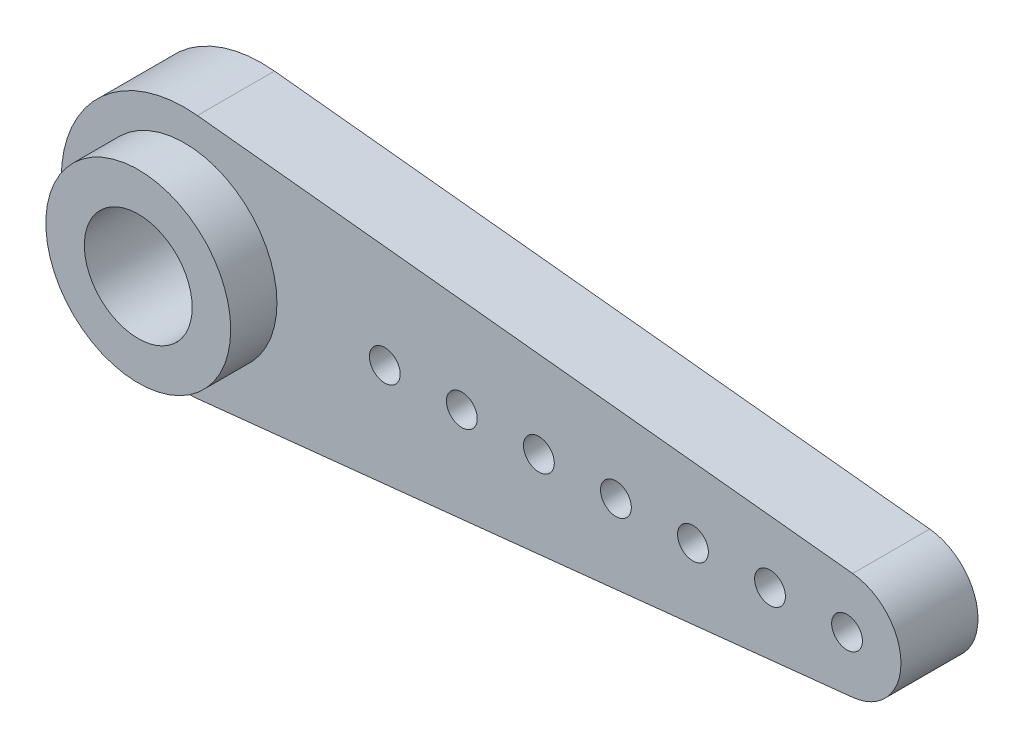
ISO-10303-21;
HEADER;
FILE_DESCRIPTION(('STEP AP214'),'2;1');
FILE_NAME('part.step','',(''),(''),'','','');
FILE_SCHEMA(('AUTOMOTIVE_DESIGN { 1 0 10303 214 1 1 1 1 }'));
ENDSEC;
DATA;
#1=APPLICATION_CONTEXT('core data for automotive mechanical design processes');
#2=APPLICATION_PROTOCOL_DEFINITION('international standard','automotive_design',2000,#1);
#3=PRODUCT_CONTEXT('',#1,'mechanical');
#4=PRODUCT('Part','Part','',(#3));
#5=PRODUCT_RELATED_PRODUCT_CATEGORY('part','',(#4));
#6=PRODUCT_DEFINITION_FORMATION('','',#4);
#7=PRODUCT_DEFINITION_CONTEXT('part definition',#1,'design');
#8=PRODUCT_DEFINITION('design','',#6,#7);
#9=PRODUCT_DEFINITION_SHAPE('','',#8);
#10=(LENGTH_UNIT() NAMED_UNIT(*) SI_UNIT(.MILLI.,.METRE.));
#11=(NAMED_UNIT(*) PLANE_ANGLE_UNIT() SI_UNIT($,.RADIAN.));
#12=(NAMED_UNIT(*) SI_UNIT($,.STERADIAN.) SOLID_ANGLE_UNIT());
#13=UNCERTAINTY_MEASURE_WITH_UNIT(LENGTH_MEASURE(1.E-05),#10,'distance_accuracy_value','');
#14=(GEOMETRIC_REPRESENTATION_CONTEXT(3) GLOBAL_UNCERTAINTY_ASSIGNED_CONTEXT((#13)) GLOBAL_UNIT_ASSIGNED_CONTEXT((#10,
#11,#12)) REPRESENTATION_CONTEXT('',''));
#15=CARTESIAN_POINT('',(0.,0.,0.));
#16=DIRECTION('',(0.,0.,1.));
#17=DIRECTION('',(1.,0.,0.));
#18=AXIS2_PLACEMENT_3D('',#15,#16,#17);
#19=CARTESIAN_POINT('',(0.,0.,5.));
#20=DIRECTION('',(0.,0.,-1.));
#21=DIRECTION('',(-1.,0.,0.));
#22=AXIS2_PLACEMENT_3D('',#19,#20,#21);
#23=CYLINDRICAL_SURFACE('',#22,1.5);
#24=CARTESIAN_POINT('',(0.,0.,0.));
#25=DIRECTION('',(0.,0.,1.));
#26=DIRECTION('',(1.,0.,0.));
#27=AXIS2_PLACEMENT_3D('',#24,#25,#26);
#28=CIRCLE('',#27,1.5);
#29=CARTESIAN_POINT('',(1.5,0.,0.));
#30=VERTEX_POINT('',#29);
#31=EDGE_CURVE('E117',#30,#30,#28,.T.);
#32=ORIENTED_EDGE('',*,*,#31,.F.);
#33=EDGE_LOOP('',(#32));
#34=FACE_BOUND('',#33,.T.);
#35=CARTESIAN_POINT('',(0.,0.,3.));
#36=DIRECTION('',(0.,0.,1.));
#37=DIRECTION('',(1.,0.,0.));
#38=AXIS2_PLACEMENT_3D('',#35,#36,#37);
#39=CIRCLE('',#38,1.5);
#40=CARTESIAN_POINT('',(1.5,0.,3.));
#41=VERTEX_POINT('',#40);
#42=EDGE_CURVE('E36',#41,#41,#39,.T.);
#43=ORIENTED_EDGE('',*,*,#42,.T.);
#44=EDGE_LOOP('',(#43));
#45=FACE_BOUND('',#44,.T.);
#46=ADVANCED_FACE('F32',(#34,#45),#23,.F.);
#47=CARTESIAN_POINT('',(0.,0.,5.));
#48=DIRECTION('',(0.,0.,1.));
#49=DIRECTION('',(1.,0.,0.));
#50=AXIS2_PLACEMENT_3D('',#47,#48,#49);
#51=PLANE('',#50);
#52=CARTESIAN_POINT('',(13.,0.,5.));
#53=DIRECTION('',(0.,0.,1.));
#54=DIRECTION('',(1.,0.,0.));
#55=AXIS2_PLACEMENT_3D('',#52,#53,#54);
#56=CIRCLE('',#55,0.999999999999998);
#57=CARTESIAN_POINT('',(14.,0.,5.));
#58=VERTEX_POINT('',#57);
#59=EDGE_CURVE('E150',#58,#58,#56,.T.);
#60=ORIENTED_EDGE('',*,*,#59,.F.);
#61=EDGE_LOOP('',(#60));
#62=FACE_BOUND('',#61,.T.);
#63=CARTESIAN_POINT('',(23.,0.,5.));
#64=DIRECTION('',(0.,0.,1.));
#65=DIRECTION('',(1.,0.,0.));
#66=AXIS2_PLACEMENT_3D('',#63,#64,#65);
#67=CIRCLE('',#66,0.999999999999998);
#68=CARTESIAN_POINT('',(24.,0.,5.));
#69=VERTEX_POINT('',#68);
#70=EDGE_CURVE('E138',#69,#69,#67,.T.);
#71=ORIENTED_EDGE('',*,*,#70,.F.);
#72=EDGE_LOOP('',(#71));
#73=FACE_BOUND('',#72,.T.);
#74=CARTESIAN_POINT('',(33.,0.,5.));
#75=DIRECTION('',(0.,0.,1.));
#76=DIRECTION('',(1.,0.,0.));
#77=AXIS2_PLACEMENT_3D('',#74,#75,#76);
#78=CIRCLE('',#77,0.999999999999998);
#79=CARTESIAN_POINT('',(34.,0.,5.));
#80=VERTEX_POINT('',#79);
#81=EDGE_CURVE('E126',#80,#80,#78,.T.);
#82=ORIENTED_EDGE('',*,*,#81,.F.);
#83=EDGE_LOOP('',(#82));
#84=FACE_BOUND('',#83,.T.);
#85=CARTESIAN_POINT('',(0.,0.,5.));
#86=DIRECTION('',(0.,0.,1.));
#87=DIRECTION('',(1.,0.,0.));
#88=AXIS2_PLACEMENT_3D('',#85,#86,#87);
#89=CIRCLE('',#88,8.00000000000001);
#90=CARTESIAN_POINT('',(0.837209302325579,7.95607193180778,5.));
#91=VERTEX_POINT('',#90);
#92=CARTESIAN_POINT('',(0.837209302325579,-7.95607193180778,5.));
#93=VERTEX_POINT('',#92);
#94=EDGE_CURVE('E86',#91,#93,#89,.T.);
#95=ORIENTED_EDGE('',*,*,#94,.T.);
#96=DIRECTION('',(0.994508991475972,0.104651162790698,0.));
#97=VECTOR('',#96,1.);
#98=CARTESIAN_POINT('',(0.837209302325579,-7.95607193180778,5.));
#99=LINE('',#98,#97);
#100=CARTESIAN_POINT('',(43.3662790697674,-3.4807814701659,5.));
#101=VERTEX_POINT('',#100);
#102=EDGE_CURVE('E80',#93,#101,#99,.T.);
#103=ORIENTED_EDGE('',*,*,#102,.T.);
#104=CARTESIAN_POINT('',(43.,0.,5.));
#105=DIRECTION('',(0.,0.,1.));
#106=DIRECTION('',(1.,0.,0.));
#107=AXIS2_PLACEMENT_3D('',#104,#105,#106);
#108=CIRCLE('',#107,3.5);
#109=CARTESIAN_POINT('',(43.3662790697674,3.4807814701659,5.));
#110=VERTEX_POINT('',#109);
#111=EDGE_CURVE('E84',#101,#110,#108,.T.);
#112=ORIENTED_EDGE('',*,*,#111,.T.);
#113=DIRECTION('',(-0.994508991475972,0.104651162790698,0.));
#114=VECTOR('',#113,1.);
#115=CARTESIAN_POINT('',(0.837209302325579,7.95607193180778,5.));
#116=LINE('',#115,#114);
#117=EDGE_CURVE('E50',#110,#91,#116,.T.);
#118=ORIENTED_EDGE('',*,*,#117,.T.);
#119=EDGE_LOOP('',(#95,#103,#112,#118));
#120=FACE_BOUND('',#119,.T.);
#121=CARTESIAN_POINT('',(43.,0.,5.));
#122=DIRECTION('',(0.,0.,1.));
#123=DIRECTION('',(1.,0.,0.));
#124=AXIS2_PLACEMENT_3D('',#121,#122,#123);
#125=CIRCLE('',#124,0.999999999999998);
#126=CARTESIAN_POINT('',(44.,0.,5.));
#127=VERTEX_POINT('',#126);
#128=EDGE_CURVE('E102',#127,#127,#125,.T.);
#129=ORIENTED_EDGE('',*,*,#128,.F.);
#130=EDGE_LOOP('',(#129));
#131=FACE_BOUND('',#130,.T.);
#132=CARTESIAN_POINT('',(38.,0.,5.));
#133=DIRECTION('',(0.,0.,1.));
#134=DIRECTION('',(1.,0.,0.));
#135=AXIS2_PLACEMENT_3D('',#132,#133,#134);
#136=CIRCLE('',#135,0.999999999999998);
#137=CARTESIAN_POINT('',(39.,0.,5.));
#138=VERTEX_POINT('',#137);
#139=EDGE_CURVE('E122',#138,#138,#136,.T.);
#140=ORIENTED_EDGE('',*,*,#139,.F.);
#141=EDGE_LOOP('',(#140));
#142=FACE_BOUND('',#141,.T.);
#143=CARTESIAN_POINT('',(28.,0.,5.));
#144=DIRECTION('',(0.,0.,1.));
#145=DIRECTION('',(1.,0.,0.));
#146=AXIS2_PLACEMENT_3D('',#143,#144,#145);
#147=CIRCLE('',#146,0.999999999999998);
#148=CARTESIAN_POINT('',(29.,0.,5.));
#149=VERTEX_POINT('',#148);
#150=EDGE_CURVE('E132',#149,#149,#147,.T.);
#151=ORIENTED_EDGE('',*,*,#150,.F.);
#152=EDGE_LOOP('',(#151));
#153=FACE_BOUND('',#152,.T.);
#154=CARTESIAN_POINT('',(18.,0.,5.));
#155=DIRECTION('',(0.,0.,1.));
#156=DIRECTION('',(1.,0.,0.));
#157=AXIS2_PLACEMENT_3D('',#154,#155,#156);
#158=CIRCLE('',#157,0.999999999999998);
#159=CARTESIAN_POINT('',(19.,0.,5.));
#160=VERTEX_POINT('',#159);
#161=EDGE_CURVE('E144',#160,#160,#158,.T.);
#162=ORIENTED_EDGE('',*,*,#161,.F.);
#163=EDGE_LOOP('',(#162));
#164=FACE_BOUND('',#163,.T.);
#165=CARTESIAN_POINT('',(0.,0.,5.));
#166=DIRECTION('',(0.,0.,1.));
#167=DIRECTION('',(1.,0.,0.));
#168=AXIS2_PLACEMENT_3D('',#165,#166,#167);
#169=CIRCLE('',#168,6.);
#170=CARTESIAN_POINT('',(6.,0.,5.));
#171=VERTEX_POINT('',#170);
#172=EDGE_CURVE('E159',#171,#171,#169,.T.);
#173=ORIENTED_EDGE('',*,*,#172,.F.);
#174=EDGE_LOOP('',(#173));
#175=FACE_BOUND('',#174,.T.);
#176=ADVANCED_FACE('F81',(#62,#73,#84,#120,#131,#142,#153,#164,#175),#51,.T.);
#177=CARTESIAN_POINT('',(0.,0.,0.));
#178=DIRECTION('',(0.,0.,1.));
#179=DIRECTION('',(1.,0.,0.));
#180=AXIS2_PLACEMENT_3D('',#177,#178,#179);
#181=PLANE('',#180);
#182=CARTESIAN_POINT('',(18.,0.,0.));
#183=DIRECTION('',(0.,0.,1.));
#184=DIRECTION('',(1.,0.,0.));
#185=AXIS2_PLACEMENT_3D('',#182,#183,#184);
#186=CIRCLE('',#185,0.999999999999998);
#187=CARTESIAN_POINT('',(19.,0.,0.));
#188=VERTEX_POINT('',#187);
#189=EDGE_CURVE('E147',#188,#188,#186,.T.);
#190=ORIENTED_EDGE('',*,*,#189,.T.);
#191=EDGE_LOOP('',(#190));
#192=FACE_BOUND('',#191,.T.);
#193=CARTESIAN_POINT('',(28.,0.,0.));
#194=DIRECTION('',(0.,0.,1.));
#195=DIRECTION('',(1.,0.,0.));
#196=AXIS2_PLACEMENT_3D('',#193,#194,#195);
#197=CIRCLE('',#196,0.999999999999998);
#198=CARTESIAN_POINT('',(29.,0.,0.));
#199=VERTEX_POINT('',#198);
#200=EDGE_CURVE('E135',#199,#199,#197,.T.);
#201=ORIENTED_EDGE('',*,*,#200,.T.);
#202=EDGE_LOOP('',(#201));
#203=FACE_BOUND('',#202,.T.);
#204=CARTESIAN_POINT('',(38.,0.,0.));
#205=DIRECTION('',(0.,0.,1.));
#206=DIRECTION('',(1.,0.,0.));
#207=AXIS2_PLACEMENT_3D('',#204,#205,#206);
#208=CIRCLE('',#207,0.999999999999998);
#209=CARTESIAN_POINT('',(39.,0.,0.));
#210=VERTEX_POINT('',#209);
#211=EDGE_CURVE('E123',#210,#210,#208,.T.);
#212=ORIENTED_EDGE('',*,*,#211,.T.);
#213=EDGE_LOOP('',(#212));
#214=FACE_BOUND('',#213,.T.);
#215=CARTESIAN_POINT('',(43.,0.,0.));
#216=DIRECTION('',(0.,0.,1.));
#217=DIRECTION('',(1.,0.,0.));
#218=AXIS2_PLACEMENT_3D('',#215,#216,#217);
#219=CIRCLE('',#218,0.999999999999998);
#220=CARTESIAN_POINT('',(44.,0.,0.));
#221=VERTEX_POINT('',#220);
#222=EDGE_CURVE('E114',#221,#221,#219,.T.);
#223=ORIENTED_EDGE('',*,*,#222,.T.);
#224=EDGE_LOOP('',(#223));
#225=FACE_BOUND('',#224,.T.);
#226=CARTESIAN_POINT('',(0.,0.,0.));
#227=DIRECTION('',(0.,0.,1.));
#228=DIRECTION('',(1.,0.,0.));
#229=AXIS2_PLACEMENT_3D('',#226,#227,#228);
#230=CIRCLE('',#229,8.00000000000001);
#231=CARTESIAN_POINT('',(0.837209302325579,7.95607193180778,0.));
#232=VERTEX_POINT('',#231);
#233=CARTESIAN_POINT('',(0.837209302325579,-7.95607193180778,0.));
#234=VERTEX_POINT('',#233);
#235=EDGE_CURVE('E99',#232,#234,#230,.T.);
#236=ORIENTED_EDGE('',*,*,#235,.F.);
#237=DIRECTION('',(-0.994508991475972,0.104651162790698,0.));
#238=VECTOR('',#237,1.);
#239=CARTESIAN_POINT('',(0.837209302325579,7.95607193180778,0.));
#240=LINE('',#239,#238);
#241=CARTESIAN_POINT('',(43.3662790697674,3.4807814701659,0.));
#242=VERTEX_POINT('',#241);
#243=EDGE_CURVE('E73',#242,#232,#240,.T.);
#244=ORIENTED_EDGE('',*,*,#243,.F.);
#245=CARTESIAN_POINT('',(43.,0.,0.));
#246=DIRECTION('',(0.,0.,1.));
#247=DIRECTION('',(1.,0.,0.));
#248=AXIS2_PLACEMENT_3D('',#245,#246,#247);
#249=CIRCLE('',#248,3.5);
#250=CARTESIAN_POINT('',(43.3662790697674,-3.4807814701659,0.));
#251=VERTEX_POINT('',#250);
#252=EDGE_CURVE('E67',#251,#242,#249,.T.);
#253=ORIENTED_EDGE('',*,*,#252,.F.);
#254=DIRECTION('',(0.994508991475972,0.104651162790698,0.));
#255=VECTOR('',#254,1.);
#256=CARTESIAN_POINT('',(0.837209302325579,-7.95607193180778,0.));
#257=LINE('',#256,#255);
#258=EDGE_CURVE('E90',#234,#251,#257,.T.);
#259=ORIENTED_EDGE('',*,*,#258,.F.);
#260=EDGE_LOOP('',(#236,#244,#253,#259));
#261=FACE_BOUND('',#260,.T.);
#262=ORIENTED_EDGE('',*,*,#31,.T.);
#263=EDGE_LOOP('',(#262));
#264=FACE_BOUND('',#263,.T.);
#265=CARTESIAN_POINT('',(33.,0.,0.));
#266=DIRECTION('',(0.,0.,1.));
#267=DIRECTION('',(1.,0.,0.));
#268=AXIS2_PLACEMENT_3D('',#265,#266,#267);
#269=CIRCLE('',#268,0.999999999999998);
#270=CARTESIAN_POINT('',(34.,0.,0.));
#271=VERTEX_POINT('',#270);
#272=EDGE_CURVE('E129',#271,#271,#269,.T.);
#273=ORIENTED_EDGE('',*,*,#272,.T.);
#274=EDGE_LOOP('',(#273));
#275=FACE_BOUND('',#274,.T.);
#276=CARTESIAN_POINT('',(23.,0.,0.));
#277=DIRECTION('',(0.,0.,1.));
#278=DIRECTION('',(1.,0.,0.));
#279=AXIS2_PLACEMENT_3D('',#276,#277,#278);
#280=CIRCLE('',#279,0.999999999999998);
#281=CARTESIAN_POINT('',(24.,0.,0.));
#282=VERTEX_POINT('',#281);
#283=EDGE_CURVE('E141',#282,#282,#280,.T.);
#284=ORIENTED_EDGE('',*,*,#283,.T.);
#285=EDGE_LOOP('',(#284));
#286=FACE_BOUND('',#285,.T.);
#287=CARTESIAN_POINT('',(13.,0.,0.));
#288=DIRECTION('',(0.,0.,1.));
#289=DIRECTION('',(1.,0.,0.));
#290=AXIS2_PLACEMENT_3D('',#287,#288,#289);
#291=CIRCLE('',#290,0.999999999999998);
#292=CARTESIAN_POINT('',(14.,0.,0.));
#293=VERTEX_POINT('',#292);
#294=EDGE_CURVE('E153',#293,#293,#291,.T.);
#295=ORIENTED_EDGE('',*,*,#294,.T.);
#296=EDGE_LOOP('',(#295));
#297=FACE_BOUND('',#296,.T.);
#298=ADVANCED_FACE('F110',(#192,#203,#214,#225,#261,#264,#275,#286,#297),#181,.F.);
#299=CARTESIAN_POINT('',(0.,0.,5.));
#300=DIRECTION('',(0.,0.,-1.));
#301=DIRECTION('',(-1.,0.,0.));
#302=AXIS2_PLACEMENT_3D('',#299,#300,#301);
#303=CYLINDRICAL_SURFACE('',#302,8.00000000000001);
#304=ORIENTED_EDGE('',*,*,#235,.T.);
#305=DIRECTION('',(0.,0.,-1.));
#306=VECTOR('',#305,1.);
#307=CARTESIAN_POINT('',(0.837209302325579,-7.95607193180778,5.));
#308=LINE('',#307,#306);
#309=EDGE_CURVE('E11',#93,#234,#308,.T.);
#310=ORIENTED_EDGE('',*,*,#309,.F.);
#311=ORIENTED_EDGE('',*,*,#94,.F.);
#312=DIRECTION('',(0.,0.,-1.));
#313=VECTOR('',#312,1.);
#314=CARTESIAN_POINT('',(0.837209302325579,7.95607193180778,5.));
#315=LINE('',#314,#313);
#316=EDGE_CURVE('E95',#91,#232,#315,.T.);
#317=ORIENTED_EDGE('',*,*,#316,.T.);
#318=EDGE_LOOP('',(#304,#310,#311,#317));
#319=FACE_BOUND('',#318,.T.);
#320=ADVANCED_FACE('F34',(#319),#303,.T.);
#321=CARTESIAN_POINT('',(0.837209302325579,-7.95607193180778,5.));
#322=DIRECTION('',(-0.104651162790698,0.994508991475972,0.));
#323=DIRECTION('',(-0.994508991475972,-0.104651162790698,0.));
#324=AXIS2_PLACEMENT_3D('',#321,#322,#323);
#325=PLANE('',#324);
#326=ORIENTED_EDGE('',*,*,#258,.T.);
#327=DIRECTION('',(0.,0.,-1.));
#328=VECTOR('',#327,1.);
#329=CARTESIAN_POINT('',(43.3662790697674,-3.4807814701659,5.));
#330=LINE('',#329,#328);
#331=EDGE_CURVE('E42',#101,#251,#330,.T.);
#332=ORIENTED_EDGE('',*,*,#331,.F.);
#333=ORIENTED_EDGE('',*,*,#102,.F.);
#334=ORIENTED_EDGE('',*,*,#309,.T.);
#335=EDGE_LOOP('',(#326,#332,#333,#334));
#336=FACE_BOUND('',#335,.T.);
#337=ADVANCED_FACE('F89',(#336),#325,.F.);
#338=CARTESIAN_POINT('',(43.,0.,5.));
#339=DIRECTION('',(0.,0.,-1.));
#340=DIRECTION('',(-1.,0.,0.));
#341=AXIS2_PLACEMENT_3D('',#338,#339,#340);
#342=CYLINDRICAL_SURFACE('',#341,3.5);
#343=ORIENTED_EDGE('',*,*,#252,.T.);
#344=DIRECTION('',(0.,0.,-1.));
#345=VECTOR('',#344,1.);
#346=CARTESIAN_POINT('',(43.3662790697674,3.4807814701659,5.));
#347=LINE('',#346,#345);
#348=EDGE_CURVE('E91',#110,#242,#347,.T.);
#349=ORIENTED_EDGE('',*,*,#348,.F.);
#350=ORIENTED_EDGE('',*,*,#111,.F.);
#351=ORIENTED_EDGE('',*,*,#331,.T.);
#352=EDGE_LOOP('',(#343,#349,#350,#351));
#353=FACE_BOUND('',#352,.T.);
#354=ADVANCED_FACE('F93',(#353),#342,.T.);
#355=CARTESIAN_POINT('',(0.837209302325579,7.95607193180778,5.));
#356=DIRECTION('',(-0.104651162790698,-0.994508991475972,0.));
#357=DIRECTION('',(0.994508991475972,-0.104651162790698,0.));
#358=AXIS2_PLACEMENT_3D('',#355,#356,#357);
#359=PLANE('',#358);
#360=ORIENTED_EDGE('',*,*,#243,.T.);
#361=ORIENTED_EDGE('',*,*,#316,.F.);
#362=ORIENTED_EDGE('',*,*,#117,.F.);
#363=ORIENTED_EDGE('',*,*,#348,.T.);
#364=EDGE_LOOP('',(#360,#361,#362,#363));
#365=FACE_BOUND('',#364,.T.);
#366=ADVANCED_FACE('F107',(#365),#359,.F.);
#367=CARTESIAN_POINT('',(43.,0.,5.));
#368=DIRECTION('',(0.,0.,-1.));
#369=DIRECTION('',(-1.,0.,0.));
#370=AXIS2_PLACEMENT_3D('',#367,#368,#369);
#371=CYLINDRICAL_SURFACE('',#370,0.999999999999998);
#372=ORIENTED_EDGE('',*,*,#128,.T.);
#373=EDGE_LOOP('',(#372));
#374=FACE_BOUND('',#373,.T.);
#375=ORIENTED_EDGE('',*,*,#222,.F.);
#376=EDGE_LOOP('',(#375));
#377=FACE_BOUND('',#376,.T.);
#378=ADVANCED_FACE('F198',(#374,#377),#371,.F.);
#379=CARTESIAN_POINT('',(38.,0.,5.));
#380=DIRECTION('',(0.,0.,-1.));
#381=DIRECTION('',(-1.,0.,0.));
#382=AXIS2_PLACEMENT_3D('',#379,#380,#381);
#383=CYLINDRICAL_SURFACE('',#382,0.999999999999998);
#384=ORIENTED_EDGE('',*,*,#139,.T.);
#385=EDGE_LOOP('',(#384));
#386=FACE_BOUND('',#385,.T.);
#387=ORIENTED_EDGE('',*,*,#211,.F.);
#388=EDGE_LOOP('',(#387));
#389=FACE_BOUND('',#388,.T.);
#390=ADVANCED_FACE('F196',(#386,#389),#383,.F.);
#391=CARTESIAN_POINT('',(33.,0.,5.));
#392=DIRECTION('',(0.,0.,-1.));
#393=DIRECTION('',(-1.,0.,0.));
#394=AXIS2_PLACEMENT_3D('',#391,#392,#393);
#395=CYLINDRICAL_SURFACE('',#394,0.999999999999998);
#396=ORIENTED_EDGE('',*,*,#81,.T.);
#397=EDGE_LOOP('',(#396));
#398=FACE_BOUND('',#397,.T.);
#399=ORIENTED_EDGE('',*,*,#272,.F.);
#400=EDGE_LOOP('',(#399));
#401=FACE_BOUND('',#400,.T.);
#402=ADVANCED_FACE('F280',(#398,#401),#395,.F.);
#403=CARTESIAN_POINT('',(28.,0.,5.));
#404=DIRECTION('',(0.,0.,-1.));
#405=DIRECTION('',(-1.,0.,0.));
#406=AXIS2_PLACEMENT_3D('',#403,#404,#405);
#407=CYLINDRICAL_SURFACE('',#406,0.999999999999998);
#408=ORIENTED_EDGE('',*,*,#150,.T.);
#409=EDGE_LOOP('',(#408));
#410=FACE_BOUND('',#409,.T.);
#411=ORIENTED_EDGE('',*,*,#200,.F.);
#412=EDGE_LOOP('',(#411));
#413=FACE_BOUND('',#412,.T.);
#414=ADVANCED_FACE('F277',(#410,#413),#407,.F.);
#415=CARTESIAN_POINT('',(23.,0.,5.));
#416=DIRECTION('',(0.,0.,-1.));
#417=DIRECTION('',(-1.,0.,0.));
#418=AXIS2_PLACEMENT_3D('',#415,#416,#417);
#419=CYLINDRICAL_SURFACE('',#418,0.999999999999998);
#420=ORIENTED_EDGE('',*,*,#70,.T.);
#421=EDGE_LOOP('',(#420));
#422=FACE_BOUND('',#421,.T.);
#423=ORIENTED_EDGE('',*,*,#283,.F.);
#424=EDGE_LOOP('',(#423));
#425=FACE_BOUND('',#424,.T.);
#426=ADVANCED_FACE('F273',(#422,#425),#419,.F.);
#427=CARTESIAN_POINT('',(18.,0.,5.));
#428=DIRECTION('',(0.,0.,-1.));
#429=DIRECTION('',(-1.,0.,0.));
#430=AXIS2_PLACEMENT_3D('',#427,#428,#429);
#431=CYLINDRICAL_SURFACE('',#430,0.999999999999998);
#432=ORIENTED_EDGE('',*,*,#161,.T.);
#433=EDGE_LOOP('',(#432));
#434=FACE_BOUND('',#433,.T.);
#435=ORIENTED_EDGE('',*,*,#189,.F.);
#436=EDGE_LOOP('',(#435));
#437=FACE_BOUND('',#436,.T.);
#438=ADVANCED_FACE('F269',(#434,#437),#431,.F.);
#439=CARTESIAN_POINT('',(13.,0.,5.));
#440=DIRECTION('',(0.,0.,-1.));
#441=DIRECTION('',(-1.,0.,0.));
#442=AXIS2_PLACEMENT_3D('',#439,#440,#441);
#443=CYLINDRICAL_SURFACE('',#442,0.999999999999998);
#444=ORIENTED_EDGE('',*,*,#59,.T.);
#445=EDGE_LOOP('',(#444));
#446=FACE_BOUND('',#445,.T.);
#447=ORIENTED_EDGE('',*,*,#294,.F.);
#448=EDGE_LOOP('',(#447));
#449=FACE_BOUND('',#448,.T.);
#450=ADVANCED_FACE('F230',(#446,#449),#443,.F.);
#451=CARTESIAN_POINT('',(0.,0.,8.));
#452=DIRECTION('',(0.,0.,-1.));
#453=DIRECTION('',(-1.,0.,0.));
#454=AXIS2_PLACEMENT_3D('',#451,#452,#453);
#455=CYLINDRICAL_SURFACE('',#454,6.);
#456=CARTESIAN_POINT('',(0.,0.,8.));
#457=DIRECTION('',(0.,0.,1.));
#458=DIRECTION('',(1.,0.,0.));
#459=AXIS2_PLACEMENT_3D('',#456,#457,#458);
#460=CIRCLE('',#459,6.);
#461=CARTESIAN_POINT('',(6.,0.,8.));
#462=VERTEX_POINT('',#461);
#463=EDGE_CURVE('E156',#462,#462,#460,.T.);
#464=ORIENTED_EDGE('',*,*,#463,.F.);
#465=EDGE_LOOP('',(#464));
#466=FACE_BOUND('',#465,.T.);
#467=ORIENTED_EDGE('',*,*,#172,.T.);
#468=EDGE_LOOP('',(#467));
#469=FACE_BOUND('',#468,.T.);
#470=ADVANCED_FACE('F234',(#466,#469),#455,.T.);
#471=CARTESIAN_POINT('',(0.,0.,8.));
#472=DIRECTION('',(0.,0.,1.));
#473=DIRECTION('',(1.,0.,0.));
#474=AXIS2_PLACEMENT_3D('',#471,#472,#473);
#475=PLANE('',#474);
#476=CARTESIAN_POINT('',(0.,0.,8.));
#477=DIRECTION('',(0.,0.,1.));
#478=DIRECTION('',(1.,0.,0.));
#479=AXIS2_PLACEMENT_3D('',#476,#477,#478);
#480=CIRCLE('',#479,3.5);
#481=CARTESIAN_POINT('',(3.5,0.,8.));
#482=VERTEX_POINT('',#481);
#483=EDGE_CURVE('E164',#482,#482,#480,.T.);
#484=ORIENTED_EDGE('',*,*,#483,.F.);
#485=EDGE_LOOP('',(#484));
#486=FACE_BOUND('',#485,.T.);
#487=ORIENTED_EDGE('',*,*,#463,.T.);
#488=EDGE_LOOP('',(#487));
#489=FACE_BOUND('',#488,.T.);
#490=ADVANCED_FACE('F182',(#486,#489),#475,.T.);
#491=CARTESIAN_POINT('',(0.,0.,3.));
#492=DIRECTION('',(0.,0.,1.));
#493=DIRECTION('',(1.,0.,0.));
#494=AXIS2_PLACEMENT_3D('',#491,#492,#493);
#495=CYLINDRICAL_SURFACE('',#494,3.5);
#496=CARTESIAN_POINT('',(0.,0.,3.));
#497=DIRECTION('',(0.,0.,1.));
#498=DIRECTION('',(1.,0.,0.));
#499=AXIS2_PLACEMENT_3D('',#496,#497,#498);
#500=CIRCLE('',#499,3.5);
#501=CARTESIAN_POINT('',(3.5,0.,3.));
#502=VERTEX_POINT('',#501);
#503=EDGE_CURVE('E167',#502,#502,#500,.T.);
#504=ORIENTED_EDGE('',*,*,#503,.F.);
#505=EDGE_LOOP('',(#504));
#506=FACE_BOUND('',#505,.T.);
#507=ORIENTED_EDGE('',*,*,#483,.T.);
#508=EDGE_LOOP('',(#507));
#509=FACE_BOUND('',#508,.T.);
#510=ADVANCED_FACE('F177',(#506,#509),#495,.F.);
#511=CARTESIAN_POINT('',(0.,0.,3.));
#512=DIRECTION('',(0.,0.,1.));
#513=DIRECTION('',(1.,0.,0.));
#514=AXIS2_PLACEMENT_3D('',#511,#512,#513);
#515=PLANE('',#514);
#516=ORIENTED_EDGE('',*,*,#42,.F.);
#517=EDGE_LOOP('',(#516));
#518=FACE_BOUND('',#517,.T.);
#519=ORIENTED_EDGE('',*,*,#503,.T.);
#520=EDGE_LOOP('',(#519));
#521=FACE_BOUND('',#520,.T.);
#522=ADVANCED_FACE('F175',(#518,#521),#515,.T.);
#523=CLOSED_SHELL('',(#46,#176,#298,#320,#337,#354,#366,#378,#390,#402,#414,#426,#438,#450,#470,
#490,#510,#522));
#524=MANIFOLD_SOLID_BREP('B2',#523);
#525=ADVANCED_BREP_SHAPE_REPRESENTATION('',(#18,#524),#14);
#526=SHAPE_DEFINITION_REPRESENTATION(#9,#525);
ENDSEC;
END-ISO-10303-21;
